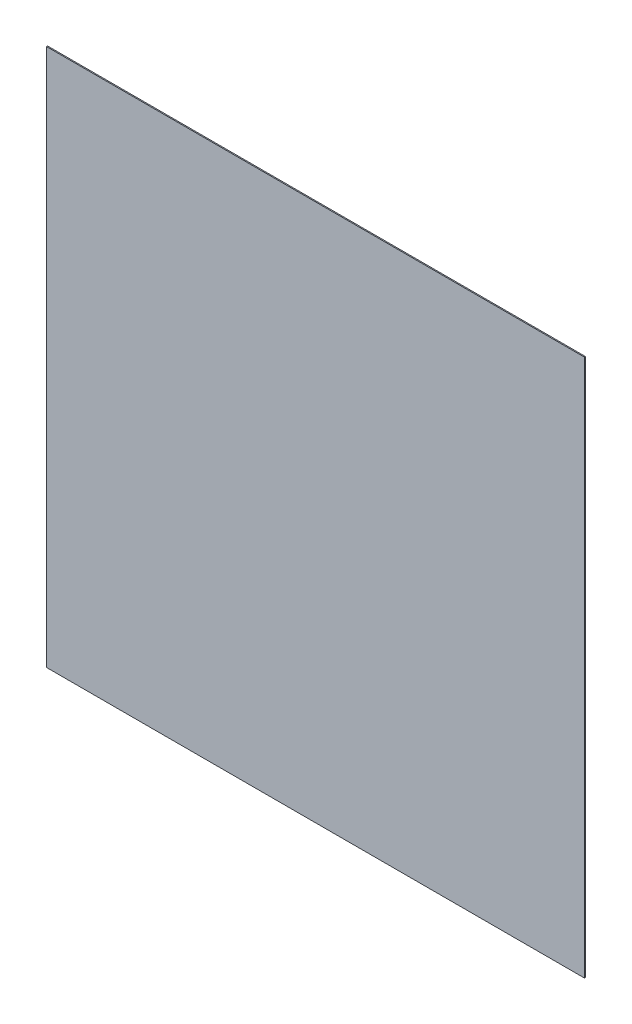
ISO-10303-21;
HEADER;
FILE_DESCRIPTION(('STEP AP214'),'2;1');
FILE_NAME('part.step','',(''),(''),'','','');
FILE_SCHEMA(('AUTOMOTIVE_DESIGN { 1 0 10303 214 1 1 1 1 }'));
ENDSEC;
DATA;
#1=APPLICATION_CONTEXT('core data for automotive mechanical design processes');
#2=APPLICATION_PROTOCOL_DEFINITION('international standard','automotive_design',2000,#1);
#3=PRODUCT_CONTEXT('',#1,'mechanical');
#4=PRODUCT('Part','Part','',(#3));
#5=PRODUCT_RELATED_PRODUCT_CATEGORY('part','',(#4));
#6=PRODUCT_DEFINITION_FORMATION('','',#4);
#7=PRODUCT_DEFINITION_CONTEXT('part definition',#1,'design');
#8=PRODUCT_DEFINITION('design','',#6,#7);
#9=PRODUCT_DEFINITION_SHAPE('','',#8);
#10=(LENGTH_UNIT() NAMED_UNIT(*) SI_UNIT(.MILLI.,.METRE.));
#11=(NAMED_UNIT(*) PLANE_ANGLE_UNIT() SI_UNIT($,.RADIAN.));
#12=(NAMED_UNIT(*) SI_UNIT($,.STERADIAN.) SOLID_ANGLE_UNIT());
#13=UNCERTAINTY_MEASURE_WITH_UNIT(LENGTH_MEASURE(1.E-05),#10,'distance_accuracy_value','');
#14=(GEOMETRIC_REPRESENTATION_CONTEXT(3) GLOBAL_UNCERTAINTY_ASSIGNED_CONTEXT((#13)) GLOBAL_UNIT_ASSIGNED_CONTEXT((#10,
#11,#12)) REPRESENTATION_CONTEXT('',''));
#15=CARTESIAN_POINT('',(0.,0.,0.));
#16=DIRECTION('',(0.,0.,1.));
#17=DIRECTION('',(1.,0.,0.));
#18=AXIS2_PLACEMENT_3D('',#15,#16,#17);
#19=CARTESIAN_POINT('',(-1252.,-1252.,5.));
#20=DIRECTION('',(1.,0.,0.));
#21=DIRECTION('',(0.,0.,-1.));
#22=AXIS2_PLACEMENT_3D('',#19,#20,#21);
#23=PLANE('',#22);
#24=DIRECTION('',(0.,-1.,0.));
#25=VECTOR('',#24,1.);
#26=CARTESIAN_POINT('',(-1252.,-1252.,0.));
#27=LINE('',#26,#25);
#28=CARTESIAN_POINT('',(-1252.,1252.,0.));
#29=VERTEX_POINT('',#28);
#30=CARTESIAN_POINT('',(-1252.,-1252.,0.));
#31=VERTEX_POINT('',#30);
#32=EDGE_CURVE('E96',#29,#31,#27,.T.);
#33=ORIENTED_EDGE('',*,*,#32,.T.);
#34=DIRECTION('',(0.,0.,-1.));
#35=VECTOR('',#34,1.);
#36=CARTESIAN_POINT('',(-1252.,-1252.,5.));
#37=LINE('',#36,#35);
#38=CARTESIAN_POINT('',(-1252.,-1252.,5.));
#39=VERTEX_POINT('',#38);
#40=EDGE_CURVE('E11',#39,#31,#37,.T.);
#41=ORIENTED_EDGE('',*,*,#40,.F.);
#42=DIRECTION('',(0.,-1.,0.));
#43=VECTOR('',#42,1.);
#44=CARTESIAN_POINT('',(-1252.,-1252.,5.));
#45=LINE('',#44,#43);
#46=CARTESIAN_POINT('',(-1252.,1252.,5.));
#47=VERTEX_POINT('',#46);
#48=EDGE_CURVE('E84',#47,#39,#45,.T.);
#49=ORIENTED_EDGE('',*,*,#48,.F.);
#50=DIRECTION('',(0.,0.,-1.));
#51=VECTOR('',#50,1.);
#52=CARTESIAN_POINT('',(-1252.,1252.,5.));
#53=LINE('',#52,#51);
#54=EDGE_CURVE('E92',#47,#29,#53,.T.);
#55=ORIENTED_EDGE('',*,*,#54,.T.);
#56=EDGE_LOOP('',(#33,#41,#49,#55));
#57=FACE_BOUND('',#56,.T.);
#58=ADVANCED_FACE('F33',(#57),#23,.F.);
#59=CARTESIAN_POINT('',(1252.,-1252.,5.));
#60=DIRECTION('',(0.,1.,0.));
#61=DIRECTION('',(-1.,0.,0.));
#62=AXIS2_PLACEMENT_3D('',#59,#60,#61);
#63=PLANE('',#62);
#64=DIRECTION('',(1.,0.,0.));
#65=VECTOR('',#64,1.);
#66=CARTESIAN_POINT('',(1252.,-1252.,0.));
#67=LINE('',#66,#65);
#68=CARTESIAN_POINT('',(1252.,-1252.,0.));
#69=VERTEX_POINT('',#68);
#70=EDGE_CURVE('E88',#31,#69,#67,.T.);
#71=ORIENTED_EDGE('',*,*,#70,.T.);
#72=DIRECTION('',(0.,0.,-1.));
#73=VECTOR('',#72,1.);
#74=CARTESIAN_POINT('',(1252.,-1252.,5.));
#75=LINE('',#74,#73);
#76=CARTESIAN_POINT('',(1252.,-1252.,5.));
#77=VERTEX_POINT('',#76);
#78=EDGE_CURVE('E41',#77,#69,#75,.T.);
#79=ORIENTED_EDGE('',*,*,#78,.F.);
#80=DIRECTION('',(1.,0.,0.));
#81=VECTOR('',#80,1.);
#82=CARTESIAN_POINT('',(1252.,-1252.,5.));
#83=LINE('',#82,#81);
#84=EDGE_CURVE('E79',#39,#77,#83,.T.);
#85=ORIENTED_EDGE('',*,*,#84,.F.);
#86=ORIENTED_EDGE('',*,*,#40,.T.);
#87=EDGE_LOOP('',(#71,#79,#85,#86));
#88=FACE_BOUND('',#87,.T.);
#89=ADVANCED_FACE('F87',(#88),#63,.F.);
#90=CARTESIAN_POINT('',(1252.,-1252.,5.));
#91=DIRECTION('',(-1.,0.,0.));
#92=DIRECTION('',(0.,0.,1.));
#93=AXIS2_PLACEMENT_3D('',#90,#91,#92);
#94=PLANE('',#93);
#95=DIRECTION('',(0.,1.,0.));
#96=VECTOR('',#95,1.);
#97=CARTESIAN_POINT('',(1252.,-1252.,0.));
#98=LINE('',#97,#96);
#99=CARTESIAN_POINT('',(1252.,1252.,0.));
#100=VERTEX_POINT('',#99);
#101=EDGE_CURVE('E66',#69,#100,#98,.T.);
#102=ORIENTED_EDGE('',*,*,#101,.T.);
#103=DIRECTION('',(0.,0.,-1.));
#104=VECTOR('',#103,1.);
#105=CARTESIAN_POINT('',(1252.,1252.,5.));
#106=LINE('',#105,#104);
#107=CARTESIAN_POINT('',(1252.,1252.,5.));
#108=VERTEX_POINT('',#107);
#109=EDGE_CURVE('E89',#108,#100,#106,.T.);
#110=ORIENTED_EDGE('',*,*,#109,.F.);
#111=DIRECTION('',(0.,1.,0.));
#112=VECTOR('',#111,1.);
#113=CARTESIAN_POINT('',(1252.,-1252.,5.));
#114=LINE('',#113,#112);
#115=EDGE_CURVE('E82',#77,#108,#114,.T.);
#116=ORIENTED_EDGE('',*,*,#115,.F.);
#117=ORIENTED_EDGE('',*,*,#78,.T.);
#118=EDGE_LOOP('',(#102,#110,#116,#117));
#119=FACE_BOUND('',#118,.T.);
#120=ADVANCED_FACE('F90',(#119),#94,.F.);
#121=CARTESIAN_POINT('',(1252.,1252.,5.));
#122=DIRECTION('',(0.,-1.,0.));
#123=DIRECTION('',(1.,0.,0.));
#124=AXIS2_PLACEMENT_3D('',#121,#122,#123);
#125=PLANE('',#124);
#126=DIRECTION('',(-1.,0.,0.));
#127=VECTOR('',#126,1.);
#128=CARTESIAN_POINT('',(1252.,1252.,0.));
#129=LINE('',#128,#127);
#130=EDGE_CURVE('E72',#100,#29,#129,.T.);
#131=ORIENTED_EDGE('',*,*,#130,.T.);
#132=ORIENTED_EDGE('',*,*,#54,.F.);
#133=DIRECTION('',(-1.,0.,0.));
#134=VECTOR('',#133,1.);
#135=CARTESIAN_POINT('',(1252.,1252.,5.));
#136=LINE('',#135,#134);
#137=EDGE_CURVE('E49',#108,#47,#136,.T.);
#138=ORIENTED_EDGE('',*,*,#137,.F.);
#139=ORIENTED_EDGE('',*,*,#109,.T.);
#140=EDGE_LOOP('',(#131,#132,#138,#139));
#141=FACE_BOUND('',#140,.T.);
#142=ADVANCED_FACE('F103',(#141),#125,.F.);
#143=CARTESIAN_POINT('',(0.,0.,5.));
#144=DIRECTION('',(0.,0.,1.));
#145=DIRECTION('',(1.,0.,0.));
#146=AXIS2_PLACEMENT_3D('',#143,#144,#145);
#147=PLANE('',#146);
#148=ORIENTED_EDGE('',*,*,#48,.T.);
#149=ORIENTED_EDGE('',*,*,#84,.T.);
#150=ORIENTED_EDGE('',*,*,#115,.T.);
#151=ORIENTED_EDGE('',*,*,#137,.T.);
#152=EDGE_LOOP('',(#148,#149,#150,#151));
#153=FACE_BOUND('',#152,.T.);
#154=ADVANCED_FACE('F80',(#153),#147,.T.);
#155=CARTESIAN_POINT('',(0.,0.,0.));
#156=DIRECTION('',(0.,0.,1.));
#157=DIRECTION('',(1.,0.,0.));
#158=AXIS2_PLACEMENT_3D('',#155,#156,#157);
#159=PLANE('',#158);
#160=ORIENTED_EDGE('',*,*,#32,.F.);
#161=ORIENTED_EDGE('',*,*,#130,.F.);
#162=ORIENTED_EDGE('',*,*,#101,.F.);
#163=ORIENTED_EDGE('',*,*,#70,.F.);
#164=EDGE_LOOP('',(#160,#161,#162,#163));
#165=FACE_BOUND('',#164,.T.);
#166=ADVANCED_FACE('F106',(#165),#159,.F.);
#167=CLOSED_SHELL('',(#58,#89,#120,#142,#154,#166));
#168=MANIFOLD_SOLID_BREP('B2',#167);
#169=ADVANCED_BREP_SHAPE_REPRESENTATION('',(#18,#168),#14);
#170=SHAPE_DEFINITION_REPRESENTATION(#9,#169);
ENDSEC;
END-ISO-10303-21;
